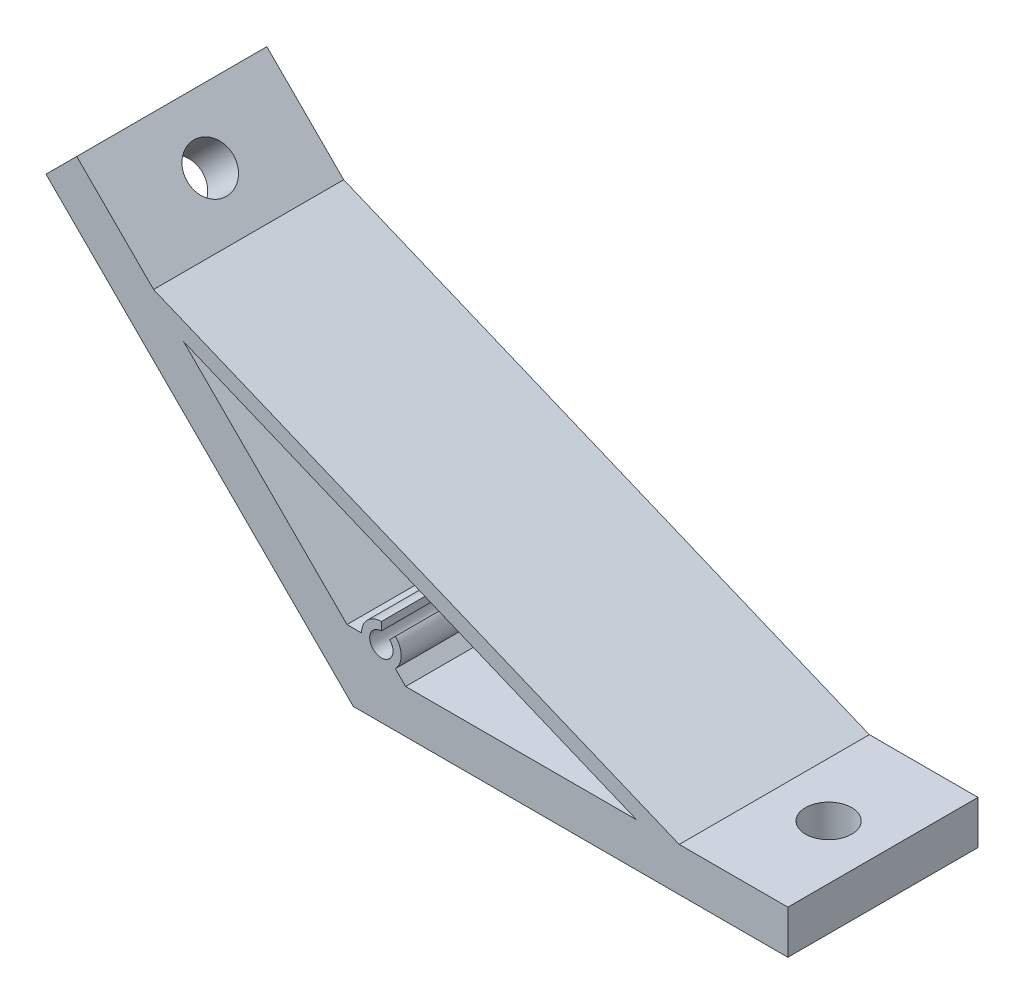
ISO-10303-21;
HEADER;
FILE_DESCRIPTION(('STEP AP214'),'2;1');
FILE_NAME('part.step','',(''),(''),'','','');
FILE_SCHEMA(('AUTOMOTIVE_DESIGN { 1 0 10303 214 1 1 1 1 }'));
ENDSEC;
DATA;
#1=APPLICATION_CONTEXT('core data for automotive mechanical design processes');
#2=APPLICATION_PROTOCOL_DEFINITION('international standard','automotive_design',2000,#1);
#3=PRODUCT_CONTEXT('',#1,'mechanical');
#4=PRODUCT('Part','Part','',(#3));
#5=PRODUCT_RELATED_PRODUCT_CATEGORY('part','',(#4));
#6=PRODUCT_DEFINITION_FORMATION('','',#4);
#7=PRODUCT_DEFINITION_CONTEXT('part definition',#1,'design');
#8=PRODUCT_DEFINITION('design','',#6,#7);
#9=PRODUCT_DEFINITION_SHAPE('','',#8);
#10=(LENGTH_UNIT() NAMED_UNIT(*) SI_UNIT(.MILLI.,.METRE.));
#11=(NAMED_UNIT(*) PLANE_ANGLE_UNIT() SI_UNIT($,.RADIAN.));
#12=(NAMED_UNIT(*) SI_UNIT($,.STERADIAN.) SOLID_ANGLE_UNIT());
#13=UNCERTAINTY_MEASURE_WITH_UNIT(LENGTH_MEASURE(1.E-05),#10,'distance_accuracy_value','');
#14=(GEOMETRIC_REPRESENTATION_CONTEXT(3) GLOBAL_UNCERTAINTY_ASSIGNED_CONTEXT((#13)) GLOBAL_UNIT_ASSIGNED_CONTEXT((#10,
#11,#12)) REPRESENTATION_CONTEXT('',''));
#15=CARTESIAN_POINT('',(0.,0.,0.));
#16=DIRECTION('',(0.,0.,1.));
#17=DIRECTION('',(1.,0.,0.));
#18=AXIS2_PLACEMENT_3D('',#15,#16,#17);
#19=CARTESIAN_POINT('',(-36.7695526216999,48.0832611206847,17.5));
#20=DIRECTION('',(-0.707106781186536,-0.707106781186559,0.));
#21=DIRECTION('',(0.707106781186559,-0.707106781186536,0.));
#22=AXIS2_PLACEMENT_3D('',#19,#20,#21);
#23=PLANE('',#22);
#24=DIRECTION('',(-0.707106781186559,0.707106781186536,0.));
#25=VECTOR('',#24,1.);
#26=CARTESIAN_POINT('',(-36.7695526216999,48.0832611206847,-17.5));
#27=LINE('',#26,#25);
#28=CARTESIAN_POINT('',(-36.7695526216999,48.0832611206847,-17.5));
#29=VERTEX_POINT('',#28);
#30=CARTESIAN_POINT('',(-50.9116882454318,62.2253967444162,-17.5));
#31=VERTEX_POINT('',#30);
#32=EDGE_CURVE('E260',#29,#31,#27,.T.);
#33=ORIENTED_EDGE('',*,*,#32,.T.);
#34=DIRECTION('',(0.,0.,-1.));
#35=VECTOR('',#34,1.);
#36=CARTESIAN_POINT('',(-50.9116882454318,62.2253967444162,17.5));
#37=LINE('',#36,#35);
#38=CARTESIAN_POINT('',(-50.9116882454318,62.2253967444162,17.5));
#39=VERTEX_POINT('',#38);
#40=EDGE_CURVE('E275',#39,#31,#37,.T.);
#41=ORIENTED_EDGE('',*,*,#40,.F.);
#42=DIRECTION('',(-0.707106781186559,0.707106781186536,0.));
#43=VECTOR('',#42,1.);
#44=CARTESIAN_POINT('',(-36.7695526216999,48.0832611206847,17.5));
#45=LINE('',#44,#43);
#46=CARTESIAN_POINT('',(-36.7695526216999,48.0832611206847,17.5));
#47=VERTEX_POINT('',#46);
#48=EDGE_CURVE('E245',#47,#39,#45,.T.);
#49=ORIENTED_EDGE('',*,*,#48,.F.);
#50=DIRECTION('',(0.,0.,-1.));
#51=VECTOR('',#50,1.);
#52=CARTESIAN_POINT('',(-36.7695526216999,48.0832611206847,17.5));
#53=LINE('',#52,#51);
#54=EDGE_CURVE('E278',#47,#29,#53,.T.);
#55=ORIENTED_EDGE('',*,*,#54,.T.);
#56=EDGE_LOOP('',(#33,#41,#49,#55));
#57=FACE_BOUND('',#56,.T.);
#58=CARTESIAN_POINT('',(-43.840620433566,55.1543289325507,0.));
#59=DIRECTION('',(-0.707106781186552,-0.707106781186543,0.));
#60=DIRECTION('',(0.707106781186543,-0.707106781186552,0.));
#61=AXIS2_PLACEMENT_3D('',#58,#59,#60);
#62=CIRCLE('',#61,4.25000000000001);
#63=CARTESIAN_POINT('',(-40.8354166135232,52.1491251125078,0.));
#64=VERTEX_POINT('',#63);
#65=EDGE_CURVE('E325',#64,#64,#62,.T.);
#66=ORIENTED_EDGE('',*,*,#65,.T.);
#67=EDGE_LOOP('',(#66));
#68=FACE_BOUND('',#67,.T.);
#69=ADVANCED_FACE('F35',(#57,#68),#23,.F.);
#70=CARTESIAN_POINT('',(0.,0.,17.5));
#71=DIRECTION('',(0.707106781186545,0.707106781186551,0.));
#72=DIRECTION('',(-0.70710678118655,0.707106781186545,0.));
#73=AXIS2_PLACEMENT_3D('',#70,#71,#72);
#74=PLANE('',#73);
#75=DIRECTION('',(0.70710678118655,-0.707106781186545,0.));
#76=VECTOR('',#75,1.);
#77=CARTESIAN_POINT('',(0.,0.,-17.5));
#78=LINE('',#77,#76);
#79=CARTESIAN_POINT('',(-56.5685424949243,56.5685424949238,-17.5));
#80=VERTEX_POINT('',#79);
#81=CARTESIAN_POINT('',(0.,0.,-17.5));
#82=VERTEX_POINT('',#81);
#83=EDGE_CURVE('E264',#80,#82,#78,.T.);
#84=ORIENTED_EDGE('',*,*,#83,.T.);
#85=DIRECTION('',(0.,0.,-1.));
#86=VECTOR('',#85,1.);
#87=CARTESIAN_POINT('',(0.,0.,17.5));
#88=LINE('',#87,#86);
#89=CARTESIAN_POINT('',(0.,0.,17.5));
#90=VERTEX_POINT('',#89);
#91=EDGE_CURVE('E269',#90,#82,#88,.T.);
#92=ORIENTED_EDGE('',*,*,#91,.F.);
#93=DIRECTION('',(0.70710678118655,-0.707106781186545,0.));
#94=VECTOR('',#93,1.);
#95=CARTESIAN_POINT('',(0.,0.,17.5));
#96=LINE('',#95,#94);
#97=CARTESIAN_POINT('',(-56.5685424949243,56.5685424949238,17.5));
#98=VERTEX_POINT('',#97);
#99=EDGE_CURVE('E249',#98,#90,#96,.T.);
#100=ORIENTED_EDGE('',*,*,#99,.F.);
#101=DIRECTION('',(0.,0.,-1.));
#102=VECTOR('',#101,1.);
#103=CARTESIAN_POINT('',(-56.5685424949243,56.5685424949238,17.5));
#104=LINE('',#103,#102);
#105=EDGE_CURVE('E272',#98,#80,#104,.T.);
#106=ORIENTED_EDGE('',*,*,#105,.T.);
#107=EDGE_LOOP('',(#84,#92,#100,#106));
#108=FACE_BOUND('',#107,.T.);
#109=CARTESIAN_POINT('',(-49.4974746830586,49.4974746830582,0.));
#110=DIRECTION('',(0.707106781186545,0.707106781186551,0.));
#111=DIRECTION('',(-0.70710678118655,0.707106781186545,0.));
#112=AXIS2_PLACEMENT_3D('',#109,#110,#111);
#113=CIRCLE('',#112,4.25000000000001);
#114=CARTESIAN_POINT('',(-52.5026785031014,52.502678503101,0.));
#115=VERTEX_POINT('',#114);
#116=EDGE_CURVE('E39',#115,#115,#113,.F.);
#117=ORIENTED_EDGE('',*,*,#116,.F.);
#118=EDGE_LOOP('',(#117));
#119=FACE_BOUND('',#118,.T.);
#120=ADVANCED_FACE('F317',(#108,#119),#74,.F.);
#121=CARTESIAN_POINT('',(0.,0.,17.5));
#122=DIRECTION('',(0.,0.,-1.));
#123=DIRECTION('',(-1.,0.,0.));
#124=AXIS2_PLACEMENT_3D('',#121,#122,#123);
#125=PLANE('',#124);
#126=DIRECTION('',(0.,1.,0.));
#127=VECTOR('',#126,1.);
#128=CARTESIAN_POINT('',(80.,8.,17.5));
#129=LINE('',#128,#127);
#130=CARTESIAN_POINT('',(80.,0.,17.5));
#131=VERTEX_POINT('',#130);
#132=CARTESIAN_POINT('',(80.,8.,17.5));
#133=VERTEX_POINT('',#132);
#134=EDGE_CURVE('E237',#131,#133,#129,.T.);
#135=ORIENTED_EDGE('',*,*,#134,.T.);
#136=DIRECTION('',(-1.,0.,0.));
#137=VECTOR('',#136,1.);
#138=CARTESIAN_POINT('',(80.,8.,17.5));
#139=LINE('',#138,#137);
#140=CARTESIAN_POINT('',(59.9999999999991,7.99999999999989,17.5));
#141=VERTEX_POINT('',#140);
#142=EDGE_CURVE('E240',#133,#141,#139,.T.);
#143=ORIENTED_EDGE('',*,*,#142,.T.);
#144=DIRECTION('',(-0.923879532511286,0.382683432365092,0.));
#145=VECTOR('',#144,1.);
#146=CARTESIAN_POINT('',(-36.7695526216999,48.0832611206847,17.5));
#147=LINE('',#146,#145);
#148=EDGE_CURVE('E243',#141,#47,#147,.T.);
#149=ORIENTED_EDGE('',*,*,#148,.T.);
#150=ORIENTED_EDGE('',*,*,#48,.T.);
#151=DIRECTION('',(-0.707106781186548,-0.707106781186548,0.));
#152=VECTOR('',#151,1.);
#153=CARTESIAN_POINT('',(-50.9116882454318,62.2253967444162,17.5));
#154=LINE('',#153,#152);
#155=EDGE_CURVE('E247',#39,#98,#154,.T.);
#156=ORIENTED_EDGE('',*,*,#155,.T.);
#157=ORIENTED_EDGE('',*,*,#99,.T.);
#158=DIRECTION('',(1.,0.,0.));
#159=VECTOR('',#158,1.);
#160=CARTESIAN_POINT('',(80.,0.,17.5));
#161=LINE('',#160,#159);
#162=EDGE_CURVE('E251',#90,#131,#161,.T.);
#163=ORIENTED_EDGE('',*,*,#162,.T.);
#164=EDGE_LOOP('',(#135,#143,#149,#150,#156,#157,#163));
#165=FACE_BOUND('',#164,.T.);
#166=DIRECTION('',(-0.92387953251129,0.382683432365082,0.));
#167=VECTOR('',#166,1.);
#168=CARTESIAN_POINT('',(-31.2262754266308,42.5399839256161,17.5));
#169=LINE('',#168,#167);
#170=CARTESIAN_POINT('',(52.1606222107425,7.99999999999989,17.5));
#171=VERTEX_POINT('',#170);
#172=CARTESIAN_POINT('',(-31.2262754266308,42.5399839256161,17.5));
#173=VERTEX_POINT('',#172);
#174=EDGE_CURVE('E155',#171,#173,#169,.T.);
#175=ORIENTED_EDGE('',*,*,#174,.F.);
#176=DIRECTION('',(1.,0.,0.));
#177=VECTOR('',#176,1.);
#178=CARTESIAN_POINT('',(52.1606222107425,7.99999999999989,17.5));
#179=LINE('',#178,#177);
#180=CARTESIAN_POINT('',(9.63860002583124,8.,17.5));
#181=VERTEX_POINT('',#180);
#182=EDGE_CURVE('E194',#181,#171,#179,.T.);
#183=ORIENTED_EDGE('',*,*,#182,.F.);
#184=DIRECTION('',(0.70710678118647,-0.707106781186625,0.));
#185=VECTOR('',#184,1.);
#186=CARTESIAN_POINT('',(9.63860002583124,8.,17.5));
#187=LINE('',#186,#185);
#188=CARTESIAN_POINT('',(7.74716608826006,9.89143393757159,17.5));
#189=VERTEX_POINT('',#188);
#190=EDGE_CURVE('E192',#189,#181,#187,.T.);
#191=ORIENTED_EDGE('',*,*,#190,.F.);
#192=CARTESIAN_POINT('',(5.16622633692896,12.4723736889023,17.5));
#193=DIRECTION('',(0.,0.,-1.));
#194=DIRECTION('',(1.,0.,0.));
#195=AXIS2_PLACEMENT_3D('',#192,#193,#194);
#196=CIRCLE('',#195,3.65);
#197=CARTESIAN_POINT('',(7.74716608826007,15.053313440233,17.5));
#198=VERTEX_POINT('',#197);
#199=EDGE_CURVE('E190',#198,#189,#196,.T.);
#200=ORIENTED_EDGE('',*,*,#199,.F.);
#201=DIRECTION('',(0.707106781186523,0.707106781186572,0.));
#202=VECTOR('',#201,1.);
#203=CARTESIAN_POINT('',(6.68650591648028,13.9926532684531,17.5));
#204=LINE('',#203,#202);
#205=CARTESIAN_POINT('',(6.68650591648028,13.9926532684531,17.5));
#206=VERTEX_POINT('',#205);
#207=EDGE_CURVE('E188',#206,#198,#204,.T.);
#208=ORIENTED_EDGE('',*,*,#207,.F.);
#209=CARTESIAN_POINT('',(5.16622633692896,12.4723736889023,17.5));
#210=DIRECTION('',(0.,0.,1.));
#211=DIRECTION('',(1.,0.,0.));
#212=AXIS2_PLACEMENT_3D('',#209,#210,#211);
#213=CIRCLE('',#212,2.15);
#214=CARTESIAN_POINT('',(5.16622633692896,14.6223736889023,17.5));
#215=VERTEX_POINT('',#214);
#216=EDGE_CURVE('E186',#215,#206,#213,.T.);
#217=ORIENTED_EDGE('',*,*,#216,.F.);
#218=DIRECTION('',(0.,-1.,0.));
#219=VECTOR('',#218,1.);
#220=CARTESIAN_POINT('',(5.16622633692896,14.6223736889023,17.5));
#221=LINE('',#220,#219);
#222=CARTESIAN_POINT('',(5.16622633692896,16.1223736889023,17.5));
#223=VERTEX_POINT('',#222);
#224=EDGE_CURVE('E184',#223,#215,#221,.T.);
#225=ORIENTED_EDGE('',*,*,#224,.F.);
#226=CARTESIAN_POINT('',(5.16622633692896,12.4723736889023,17.5));
#227=DIRECTION('',(0.,0.,-1.));
#228=DIRECTION('',(1.,0.,0.));
#229=AXIS2_PLACEMENT_3D('',#226,#227,#228);
#230=CIRCLE('',#229,3.65);
#231=CARTESIAN_POINT('',(1.51622633692896,12.4723736889023,17.5));
#232=VERTEX_POINT('',#231);
#233=EDGE_CURVE('E179',#232,#223,#230,.T.);
#234=ORIENTED_EDGE('',*,*,#233,.F.);
#235=DIRECTION('',(1.,0.,0.));
#236=VECTOR('',#235,1.);
#237=CARTESIAN_POINT('',(-1.15866518991743,12.4723736889023,17.5));
#238=LINE('',#237,#236);
#239=CARTESIAN_POINT('',(-1.15866518991743,12.4723736889023,17.5));
#240=VERTEX_POINT('',#239);
#241=EDGE_CURVE('E177',#240,#232,#238,.T.);
#242=ORIENTED_EDGE('',*,*,#241,.F.);
#243=DIRECTION('',(0.707106781186542,-0.707106781186553,0.));
#244=VECTOR('',#243,1.);
#245=CARTESIAN_POINT('',(-1.15866518991743,12.4723736889023,17.5));
#246=LINE('',#245,#244);
#247=EDGE_CURVE('E163',#173,#240,#246,.T.);
#248=ORIENTED_EDGE('',*,*,#247,.F.);
#249=EDGE_LOOP('',(#175,#183,#191,#200,#208,#217,#225,#234,#242,#248));
#250=FACE_BOUND('',#249,.T.);
#251=ADVANCED_FACE('F175',(#165,#250),#125,.F.);
#252=CARTESIAN_POINT('',(0.,0.,-17.5));
#253=DIRECTION('',(0.,0.,-1.));
#254=DIRECTION('',(-1.,0.,0.));
#255=AXIS2_PLACEMENT_3D('',#252,#253,#254);
#256=PLANE('',#255);
#257=DIRECTION('',(0.,1.,0.));
#258=VECTOR('',#257,1.);
#259=CARTESIAN_POINT('',(80.,8.,-17.5));
#260=LINE('',#259,#258);
#261=CARTESIAN_POINT('',(80.,0.,-17.5));
#262=VERTEX_POINT('',#261);
#263=CARTESIAN_POINT('',(80.,8.,-17.5));
#264=VERTEX_POINT('',#263);
#265=EDGE_CURVE('E171',#262,#264,#260,.T.);
#266=ORIENTED_EDGE('',*,*,#265,.F.);
#267=DIRECTION('',(1.,0.,0.));
#268=VECTOR('',#267,1.);
#269=CARTESIAN_POINT('',(80.,0.,-17.5));
#270=LINE('',#269,#268);
#271=EDGE_CURVE('E241',#82,#262,#270,.T.);
#272=ORIENTED_EDGE('',*,*,#271,.F.);
#273=ORIENTED_EDGE('',*,*,#83,.F.);
#274=DIRECTION('',(-0.707106781186548,-0.707106781186548,0.));
#275=VECTOR('',#274,1.);
#276=CARTESIAN_POINT('',(-50.9116882454318,62.2253967444162,-17.5));
#277=LINE('',#276,#275);
#278=EDGE_CURVE('E262',#31,#80,#277,.T.);
#279=ORIENTED_EDGE('',*,*,#278,.F.);
#280=ORIENTED_EDGE('',*,*,#32,.F.);
#281=DIRECTION('',(-0.923879532511286,0.382683432365092,0.));
#282=VECTOR('',#281,1.);
#283=CARTESIAN_POINT('',(-36.7695526216999,48.0832611206847,-17.5));
#284=LINE('',#283,#282);
#285=CARTESIAN_POINT('',(59.9999999999991,7.99999999999989,-17.5));
#286=VERTEX_POINT('',#285);
#287=EDGE_CURVE('E258',#286,#29,#284,.T.);
#288=ORIENTED_EDGE('',*,*,#287,.F.);
#289=DIRECTION('',(-1.,0.,0.));
#290=VECTOR('',#289,1.);
#291=CARTESIAN_POINT('',(80.,8.,-17.5));
#292=LINE('',#291,#290);
#293=EDGE_CURVE('E256',#264,#286,#292,.T.);
#294=ORIENTED_EDGE('',*,*,#293,.F.);
#295=EDGE_LOOP('',(#266,#272,#273,#279,#280,#288,#294));
#296=FACE_BOUND('',#295,.T.);
#297=DIRECTION('',(1.,0.,0.));
#298=VECTOR('',#297,1.);
#299=CARTESIAN_POINT('',(52.1606222107425,7.99999999999989,-17.5));
#300=LINE('',#299,#298);
#301=CARTESIAN_POINT('',(9.63860002583124,8.,-17.5));
#302=VERTEX_POINT('',#301);
#303=CARTESIAN_POINT('',(52.1606222107425,7.99999999999989,-17.5));
#304=VERTEX_POINT('',#303);
#305=EDGE_CURVE('E164',#302,#304,#300,.T.);
#306=ORIENTED_EDGE('',*,*,#305,.T.);
#307=DIRECTION('',(-0.92387953251129,0.382683432365082,0.));
#308=VECTOR('',#307,1.);
#309=CARTESIAN_POINT('',(-31.2262754266308,42.5399839256161,-17.5));
#310=LINE('',#309,#308);
#311=CARTESIAN_POINT('',(-31.2262754266308,42.5399839256161,-17.5));
#312=VERTEX_POINT('',#311);
#313=EDGE_CURVE('E59',#304,#312,#310,.T.);
#314=ORIENTED_EDGE('',*,*,#313,.T.);
#315=DIRECTION('',(0.707106781186542,-0.707106781186553,0.));
#316=VECTOR('',#315,1.);
#317=CARTESIAN_POINT('',(-1.15866518991743,12.4723736889023,-17.5));
#318=LINE('',#317,#316);
#319=CARTESIAN_POINT('',(-1.15866518991743,12.4723736889023,-17.5));
#320=VERTEX_POINT('',#319);
#321=EDGE_CURVE('E170',#312,#320,#318,.T.);
#322=ORIENTED_EDGE('',*,*,#321,.T.);
#323=DIRECTION('',(1.,0.,0.));
#324=VECTOR('',#323,1.);
#325=CARTESIAN_POINT('',(-1.15866518991743,12.4723736889023,-17.5));
#326=LINE('',#325,#324);
#327=CARTESIAN_POINT('',(1.51622633692896,12.4723736889023,-17.5));
#328=VERTEX_POINT('',#327);
#329=EDGE_CURVE('E199',#320,#328,#326,.T.);
#330=ORIENTED_EDGE('',*,*,#329,.T.);
#331=CARTESIAN_POINT('',(5.16622633692896,12.4723736889023,-17.5));
#332=DIRECTION('',(0.,0.,-1.));
#333=DIRECTION('',(1.,0.,0.));
#334=AXIS2_PLACEMENT_3D('',#331,#332,#333);
#335=CIRCLE('',#334,3.65);
#336=CARTESIAN_POINT('',(5.16622633692896,16.1223736889023,-17.5));
#337=VERTEX_POINT('',#336);
#338=EDGE_CURVE('E202',#328,#337,#335,.T.);
#339=ORIENTED_EDGE('',*,*,#338,.T.);
#340=DIRECTION('',(0.,-1.,0.));
#341=VECTOR('',#340,1.);
#342=CARTESIAN_POINT('',(5.16622633692896,14.6223736889023,-17.5));
#343=LINE('',#342,#341);
#344=CARTESIAN_POINT('',(5.16622633692896,14.6223736889023,-17.5));
#345=VERTEX_POINT('',#344);
#346=EDGE_CURVE('E205',#337,#345,#343,.T.);
#347=ORIENTED_EDGE('',*,*,#346,.T.);
#348=CARTESIAN_POINT('',(5.16622633692896,12.4723736889023,-17.5));
#349=DIRECTION('',(0.,0.,1.));
#350=DIRECTION('',(1.,0.,0.));
#351=AXIS2_PLACEMENT_3D('',#348,#349,#350);
#352=CIRCLE('',#351,2.15);
#353=CARTESIAN_POINT('',(6.68650591648028,13.9926532684531,-17.5));
#354=VERTEX_POINT('',#353);
#355=EDGE_CURVE('E208',#345,#354,#352,.T.);
#356=ORIENTED_EDGE('',*,*,#355,.T.);
#357=DIRECTION('',(0.707106781186523,0.707106781186572,0.));
#358=VECTOR('',#357,1.);
#359=CARTESIAN_POINT('',(6.68650591648028,13.9926532684531,-17.5));
#360=LINE('',#359,#358);
#361=CARTESIAN_POINT('',(7.74716608826007,15.053313440233,-17.5));
#362=VERTEX_POINT('',#361);
#363=EDGE_CURVE('E211',#354,#362,#360,.T.);
#364=ORIENTED_EDGE('',*,*,#363,.T.);
#365=CARTESIAN_POINT('',(5.16622633692896,12.4723736889023,-17.5));
#366=DIRECTION('',(0.,0.,-1.));
#367=DIRECTION('',(1.,0.,0.));
#368=AXIS2_PLACEMENT_3D('',#365,#366,#367);
#369=CIRCLE('',#368,3.65);
#370=CARTESIAN_POINT('',(7.74716608826006,9.89143393757159,-17.5));
#371=VERTEX_POINT('',#370);
#372=EDGE_CURVE('E214',#362,#371,#369,.T.);
#373=ORIENTED_EDGE('',*,*,#372,.T.);
#374=DIRECTION('',(0.70710678118647,-0.707106781186625,0.));
#375=VECTOR('',#374,1.);
#376=CARTESIAN_POINT('',(9.63860002583124,8.,-17.5));
#377=LINE('',#376,#375);
#378=EDGE_CURVE('E217',#371,#302,#377,.T.);
#379=ORIENTED_EDGE('',*,*,#378,.T.);
#380=EDGE_LOOP('',(#306,#314,#322,#330,#339,#347,#356,#364,#373,#379));
#381=FACE_BOUND('',#380,.T.);
#382=ADVANCED_FACE('F292',(#296,#381),#256,.T.);
#383=CARTESIAN_POINT('',(80.,8.,17.5));
#384=DIRECTION('',(-1.,0.,0.));
#385=DIRECTION('',(0.,0.,1.));
#386=AXIS2_PLACEMENT_3D('',#383,#384,#385);
#387=PLANE('',#386);
#388=ORIENTED_EDGE('',*,*,#265,.T.);
#389=DIRECTION('',(0.,0.,-1.));
#390=VECTOR('',#389,1.);
#391=CARTESIAN_POINT('',(80.,8.,17.5));
#392=LINE('',#391,#390);
#393=EDGE_CURVE('E11',#133,#264,#392,.T.);
#394=ORIENTED_EDGE('',*,*,#393,.F.);
#395=ORIENTED_EDGE('',*,*,#134,.F.);
#396=DIRECTION('',(0.,0.,-1.));
#397=VECTOR('',#396,1.);
#398=CARTESIAN_POINT('',(80.,0.,17.5));
#399=LINE('',#398,#397);
#400=EDGE_CURVE('E253',#131,#262,#399,.T.);
#401=ORIENTED_EDGE('',*,*,#400,.T.);
#402=EDGE_LOOP('',(#388,#394,#395,#401));
#403=FACE_BOUND('',#402,.T.);
#404=ADVANCED_FACE('F37',(#403),#387,.F.);
#405=CARTESIAN_POINT('',(80.,8.,17.5));
#406=DIRECTION('',(0.,-1.,0.));
#407=DIRECTION('',(1.,0.,0.));
#408=AXIS2_PLACEMENT_3D('',#405,#406,#407);
#409=PLANE('',#408);
#410=CARTESIAN_POINT('',(70.,7.99999999999994,0.));
#411=DIRECTION('',(0.,1.,0.));
#412=DIRECTION('',(-1.,0.,0.));
#413=AXIS2_PLACEMENT_3D('',#410,#411,#412);
#414=CIRCLE('',#413,4.25000000000001);
#415=CARTESIAN_POINT('',(65.75,7.99999999999992,0.));
#416=VERTEX_POINT('',#415);
#417=EDGE_CURVE('E324',#416,#416,#414,.T.);
#418=ORIENTED_EDGE('',*,*,#417,.F.);
#419=EDGE_LOOP('',(#418));
#420=FACE_BOUND('',#419,.T.);
#421=ORIENTED_EDGE('',*,*,#293,.T.);
#422=DIRECTION('',(0.,0.,-1.));
#423=VECTOR('',#422,1.);
#424=CARTESIAN_POINT('',(59.9999999999991,7.99999999999989,17.5));
#425=LINE('',#424,#423);
#426=EDGE_CURVE('E44',#141,#286,#425,.T.);
#427=ORIENTED_EDGE('',*,*,#426,.F.);
#428=ORIENTED_EDGE('',*,*,#142,.F.);
#429=ORIENTED_EDGE('',*,*,#393,.T.);
#430=EDGE_LOOP('',(#421,#427,#428,#429));
#431=FACE_BOUND('',#430,.T.);
#432=ADVANCED_FACE('F309',(#420,#431),#409,.F.);
#433=CARTESIAN_POINT('',(-36.7695526216999,48.0832611206847,17.5));
#434=DIRECTION('',(-0.382683432365092,-0.923879532511286,0.));
#435=DIRECTION('',(0.923879532511286,-0.382683432365092,0.));
#436=AXIS2_PLACEMENT_3D('',#433,#434,#435);
#437=PLANE('',#436);
#438=ORIENTED_EDGE('',*,*,#287,.T.);
#439=ORIENTED_EDGE('',*,*,#54,.F.);
#440=ORIENTED_EDGE('',*,*,#148,.F.);
#441=ORIENTED_EDGE('',*,*,#426,.T.);
#442=EDGE_LOOP('',(#438,#439,#440,#441));
#443=FACE_BOUND('',#442,.T.);
#444=ADVANCED_FACE('F286',(#443),#437,.F.);
#445=CARTESIAN_POINT('',(-50.9116882454318,62.2253967444162,17.5));
#446=DIRECTION('',(0.707106781186548,-0.707106781186548,0.));
#447=DIRECTION('',(0.707106781186548,0.707106781186548,0.));
#448=AXIS2_PLACEMENT_3D('',#445,#446,#447);
#449=PLANE('',#448);
#450=ORIENTED_EDGE('',*,*,#278,.T.);
#451=ORIENTED_EDGE('',*,*,#105,.F.);
#452=ORIENTED_EDGE('',*,*,#155,.F.);
#453=ORIENTED_EDGE('',*,*,#40,.T.);
#454=EDGE_LOOP('',(#450,#451,#452,#453));
#455=FACE_BOUND('',#454,.T.);
#456=ADVANCED_FACE('F302',(#455),#449,.F.);
#457=CARTESIAN_POINT('',(80.,0.,17.5));
#458=DIRECTION('',(0.,1.,0.));
#459=DIRECTION('',(0.,0.,1.));
#460=AXIS2_PLACEMENT_3D('',#457,#458,#459);
#461=PLANE('',#460);
#462=CARTESIAN_POINT('',(70.,0.,0.));
#463=DIRECTION('',(0.,1.,0.));
#464=DIRECTION('',(-1.,0.,0.));
#465=AXIS2_PLACEMENT_3D('',#462,#463,#464);
#466=CIRCLE('',#465,4.25000000000001);
#467=CARTESIAN_POINT('',(65.75,0.,0.));
#468=VERTEX_POINT('',#467);
#469=EDGE_CURVE('E197',#468,#468,#466,.T.);
#470=ORIENTED_EDGE('',*,*,#469,.T.);
#471=EDGE_LOOP('',(#470));
#472=FACE_BOUND('',#471,.T.);
#473=ORIENTED_EDGE('',*,*,#271,.T.);
#474=ORIENTED_EDGE('',*,*,#400,.F.);
#475=ORIENTED_EDGE('',*,*,#162,.F.);
#476=ORIENTED_EDGE('',*,*,#91,.T.);
#477=EDGE_LOOP('',(#473,#474,#475,#476));
#478=FACE_BOUND('',#477,.T.);
#479=ADVANCED_FACE('F314',(#472,#478),#461,.F.);
#480=CARTESIAN_POINT('',(-31.2262754266308,42.5399839256161,17.5));
#481=DIRECTION('',(-0.382683432365082,-0.92387953251129,0.));
#482=DIRECTION('',(0.92387953251129,-0.382683432365082,0.));
#483=AXIS2_PLACEMENT_3D('',#480,#481,#482);
#484=PLANE('',#483);
#485=ORIENTED_EDGE('',*,*,#313,.F.);
#486=DIRECTION('',(0.,0.,-1.));
#487=VECTOR('',#486,1.);
#488=CARTESIAN_POINT('',(52.1606222107425,7.99999999999989,17.5));
#489=LINE('',#488,#487);
#490=EDGE_CURVE('E159',#171,#304,#489,.T.);
#491=ORIENTED_EDGE('',*,*,#490,.F.);
#492=ORIENTED_EDGE('',*,*,#174,.T.);
#493=DIRECTION('',(0.,0.,-1.));
#494=VECTOR('',#493,1.);
#495=CARTESIAN_POINT('',(-31.2262754266308,42.5399839256161,17.5));
#496=LINE('',#495,#494);
#497=EDGE_CURVE('E158',#173,#312,#496,.T.);
#498=ORIENTED_EDGE('',*,*,#497,.T.);
#499=EDGE_LOOP('',(#485,#491,#492,#498));
#500=FACE_BOUND('',#499,.T.);
#501=ADVANCED_FACE('F157',(#500),#484,.T.);
#502=CARTESIAN_POINT('',(-1.15866518991743,12.4723736889023,17.5));
#503=DIRECTION('',(0.707106781186553,0.707106781186542,0.));
#504=DIRECTION('',(-0.707106781186542,0.707106781186553,0.));
#505=AXIS2_PLACEMENT_3D('',#502,#503,#504);
#506=PLANE('',#505);
#507=ORIENTED_EDGE('',*,*,#321,.F.);
#508=ORIENTED_EDGE('',*,*,#497,.F.);
#509=ORIENTED_EDGE('',*,*,#247,.T.);
#510=DIRECTION('',(0.,0.,-1.));
#511=VECTOR('',#510,1.);
#512=CARTESIAN_POINT('',(-1.15866518991743,12.4723736889023,17.5));
#513=LINE('',#512,#511);
#514=EDGE_CURVE('E172',#240,#320,#513,.T.);
#515=ORIENTED_EDGE('',*,*,#514,.T.);
#516=EDGE_LOOP('',(#507,#508,#509,#515));
#517=FACE_BOUND('',#516,.T.);
#518=ADVANCED_FACE('F167',(#517),#506,.T.);
#519=CARTESIAN_POINT('',(-1.15866518991743,12.4723736889023,17.5));
#520=DIRECTION('',(0.,1.,0.));
#521=DIRECTION('',(0.,0.,1.));
#522=AXIS2_PLACEMENT_3D('',#519,#520,#521);
#523=PLANE('',#522);
#524=ORIENTED_EDGE('',*,*,#329,.F.);
#525=ORIENTED_EDGE('',*,*,#514,.F.);
#526=ORIENTED_EDGE('',*,*,#241,.T.);
#527=DIRECTION('',(0.,0.,-1.));
#528=VECTOR('',#527,1.);
#529=CARTESIAN_POINT('',(1.51622633692896,12.4723736889023,17.5));
#530=LINE('',#529,#528);
#531=EDGE_CURVE('E234',#232,#328,#530,.T.);
#532=ORIENTED_EDGE('',*,*,#531,.T.);
#533=EDGE_LOOP('',(#524,#525,#526,#532));
#534=FACE_BOUND('',#533,.T.);
#535=ADVANCED_FACE('F366',(#534),#523,.T.);
#536=CARTESIAN_POINT('',(5.16622633692896,12.4723736889023,17.5));
#537=DIRECTION('',(0.,0.,-1.));
#538=DIRECTION('',(-1.,0.,0.));
#539=AXIS2_PLACEMENT_3D('',#536,#537,#538);
#540=CYLINDRICAL_SURFACE('',#539,3.65);
#541=ORIENTED_EDGE('',*,*,#338,.F.);
#542=ORIENTED_EDGE('',*,*,#531,.F.);
#543=ORIENTED_EDGE('',*,*,#233,.T.);
#544=DIRECTION('',(0.,0.,-1.));
#545=VECTOR('',#544,1.);
#546=CARTESIAN_POINT('',(5.16622633692896,16.1223736889023,17.5));
#547=LINE('',#546,#545);
#548=EDGE_CURVE('E232',#223,#337,#547,.T.);
#549=ORIENTED_EDGE('',*,*,#548,.T.);
#550=EDGE_LOOP('',(#541,#542,#543,#549));
#551=FACE_BOUND('',#550,.T.);
#552=ADVANCED_FACE('F369',(#551),#540,.T.);
#553=CARTESIAN_POINT('',(5.16622633692896,14.6223736889023,17.5));
#554=DIRECTION('',(1.,0.,0.));
#555=DIRECTION('',(0.,0.,-1.));
#556=AXIS2_PLACEMENT_3D('',#553,#554,#555);
#557=PLANE('',#556);
#558=ORIENTED_EDGE('',*,*,#346,.F.);
#559=ORIENTED_EDGE('',*,*,#548,.F.);
#560=ORIENTED_EDGE('',*,*,#224,.T.);
#561=DIRECTION('',(0.,0.,-1.));
#562=VECTOR('',#561,1.);
#563=CARTESIAN_POINT('',(5.16622633692896,14.6223736889023,17.5));
#564=LINE('',#563,#562);
#565=EDGE_CURVE('E230',#215,#345,#564,.T.);
#566=ORIENTED_EDGE('',*,*,#565,.T.);
#567=EDGE_LOOP('',(#558,#559,#560,#566));
#568=FACE_BOUND('',#567,.T.);
#569=ADVANCED_FACE('F373',(#568),#557,.T.);
#570=CARTESIAN_POINT('',(5.16622633692896,12.4723736889023,17.5));
#571=DIRECTION('',(0.,0.,-1.));
#572=DIRECTION('',(-1.,0.,0.));
#573=AXIS2_PLACEMENT_3D('',#570,#571,#572);
#574=CYLINDRICAL_SURFACE('',#573,2.15);
#575=ORIENTED_EDGE('',*,*,#355,.F.);
#576=ORIENTED_EDGE('',*,*,#565,.F.);
#577=ORIENTED_EDGE('',*,*,#216,.T.);
#578=DIRECTION('',(0.,0.,-1.));
#579=VECTOR('',#578,1.);
#580=CARTESIAN_POINT('',(6.68650591648028,13.9926532684531,17.5));
#581=LINE('',#580,#579);
#582=EDGE_CURVE('E228',#206,#354,#581,.T.);
#583=ORIENTED_EDGE('',*,*,#582,.T.);
#584=EDGE_LOOP('',(#575,#576,#577,#583));
#585=FACE_BOUND('',#584,.T.);
#586=ADVANCED_FACE('F377',(#585),#574,.F.);
#587=CARTESIAN_POINT('',(6.68650591648028,13.9926532684531,17.5));
#588=DIRECTION('',(-0.707106781186572,0.707106781186523,0.));
#589=DIRECTION('',(-0.707106781186523,-0.707106781186572,0.));
#590=AXIS2_PLACEMENT_3D('',#587,#588,#589);
#591=PLANE('',#590);
#592=ORIENTED_EDGE('',*,*,#363,.F.);
#593=ORIENTED_EDGE('',*,*,#582,.F.);
#594=ORIENTED_EDGE('',*,*,#207,.T.);
#595=DIRECTION('',(0.,0.,-1.));
#596=VECTOR('',#595,1.);
#597=CARTESIAN_POINT('',(7.74716608826007,15.053313440233,17.5));
#598=LINE('',#597,#596);
#599=EDGE_CURVE('E226',#198,#362,#598,.T.);
#600=ORIENTED_EDGE('',*,*,#599,.T.);
#601=EDGE_LOOP('',(#592,#593,#594,#600));
#602=FACE_BOUND('',#601,.T.);
#603=ADVANCED_FACE('F381',(#602),#591,.T.);
#604=CARTESIAN_POINT('',(5.16622633692896,12.4723736889023,17.5));
#605=DIRECTION('',(0.,0.,-1.));
#606=DIRECTION('',(-1.,0.,0.));
#607=AXIS2_PLACEMENT_3D('',#604,#605,#606);
#608=CYLINDRICAL_SURFACE('',#607,3.65);
#609=ORIENTED_EDGE('',*,*,#372,.F.);
#610=ORIENTED_EDGE('',*,*,#599,.F.);
#611=ORIENTED_EDGE('',*,*,#199,.T.);
#612=DIRECTION('',(0.,0.,-1.));
#613=VECTOR('',#612,1.);
#614=CARTESIAN_POINT('',(7.74716608826006,9.89143393757159,17.5));
#615=LINE('',#614,#613);
#616=EDGE_CURVE('E224',#189,#371,#615,.T.);
#617=ORIENTED_EDGE('',*,*,#616,.T.);
#618=EDGE_LOOP('',(#609,#610,#611,#617));
#619=FACE_BOUND('',#618,.T.);
#620=ADVANCED_FACE('F385',(#619),#608,.T.);
#621=CARTESIAN_POINT('',(9.63860002583124,8.,17.5));
#622=DIRECTION('',(0.707106781186625,0.70710678118647,0.));
#623=DIRECTION('',(-0.70710678118647,0.707106781186625,0.));
#624=AXIS2_PLACEMENT_3D('',#621,#622,#623);
#625=PLANE('',#624);
#626=ORIENTED_EDGE('',*,*,#378,.F.);
#627=ORIENTED_EDGE('',*,*,#616,.F.);
#628=ORIENTED_EDGE('',*,*,#190,.T.);
#629=DIRECTION('',(0.,0.,-1.));
#630=VECTOR('',#629,1.);
#631=CARTESIAN_POINT('',(9.63860002583124,8.,17.5));
#632=LINE('',#631,#630);
#633=EDGE_CURVE('E51',#181,#302,#632,.T.);
#634=ORIENTED_EDGE('',*,*,#633,.T.);
#635=EDGE_LOOP('',(#626,#627,#628,#634));
#636=FACE_BOUND('',#635,.T.);
#637=ADVANCED_FACE('F389',(#636),#625,.T.);
#638=CARTESIAN_POINT('',(52.1606222107425,7.99999999999989,17.5));
#639=DIRECTION('',(0.,1.,0.));
#640=DIRECTION('',(-1.,0.,0.));
#641=AXIS2_PLACEMENT_3D('',#638,#639,#640);
#642=PLANE('',#641);
#643=ORIENTED_EDGE('',*,*,#305,.F.);
#644=ORIENTED_EDGE('',*,*,#633,.F.);
#645=ORIENTED_EDGE('',*,*,#182,.T.);
#646=ORIENTED_EDGE('',*,*,#490,.T.);
#647=EDGE_LOOP('',(#643,#644,#645,#646));
#648=FACE_BOUND('',#647,.T.);
#649=ADVANCED_FACE('F339',(#648),#642,.T.);
#650=CARTESIAN_POINT('',(70.,0.,0.));
#651=DIRECTION('',(0.,1.,0.));
#652=DIRECTION('',(-1.,0.,0.));
#653=AXIS2_PLACEMENT_3D('',#650,#651,#652);
#654=CYLINDRICAL_SURFACE('',#653,4.25000000000001);
#655=ORIENTED_EDGE('',*,*,#469,.F.);
#656=EDGE_LOOP('',(#655));
#657=FACE_BOUND('',#656,.T.);
#658=ORIENTED_EDGE('',*,*,#417,.T.);
#659=EDGE_LOOP('',(#658));
#660=FACE_BOUND('',#659,.T.);
#661=ADVANCED_FACE('F335',(#657,#660),#654,.F.);
#662=CARTESIAN_POINT('',(-77.7817459305206,21.2132034355965,0.));
#663=DIRECTION('',(0.707106781186552,0.707106781186544,0.));
#664=DIRECTION('',(-0.707106781186544,0.707106781186552,0.));
#665=AXIS2_PLACEMENT_3D('',#662,#663,#664);
#666=CYLINDRICAL_SURFACE('',#665,4.25000000000001);
#667=ORIENTED_EDGE('',*,*,#65,.F.);
#668=EDGE_LOOP('',(#667));
#669=FACE_BOUND('',#668,.T.);
#670=ORIENTED_EDGE('',*,*,#116,.T.);
#671=EDGE_LOOP('',(#670));
#672=FACE_BOUND('',#671,.T.);
#673=ADVANCED_FACE('F338',(#669,#672),#666,.F.);
#674=CLOSED_SHELL('',(#69,#120,#251,#382,#404,#432,#444,#456,#479,#501,#518,#535,#552,#569,#586,
#603,#620,#637,#649,#661,#673));
#675=MANIFOLD_SOLID_BREP('B2',#674);
#676=ADVANCED_BREP_SHAPE_REPRESENTATION('',(#18,#675),#14);
#677=SHAPE_DEFINITION_REPRESENTATION(#9,#676);
ENDSEC;
END-ISO-10303-21;
